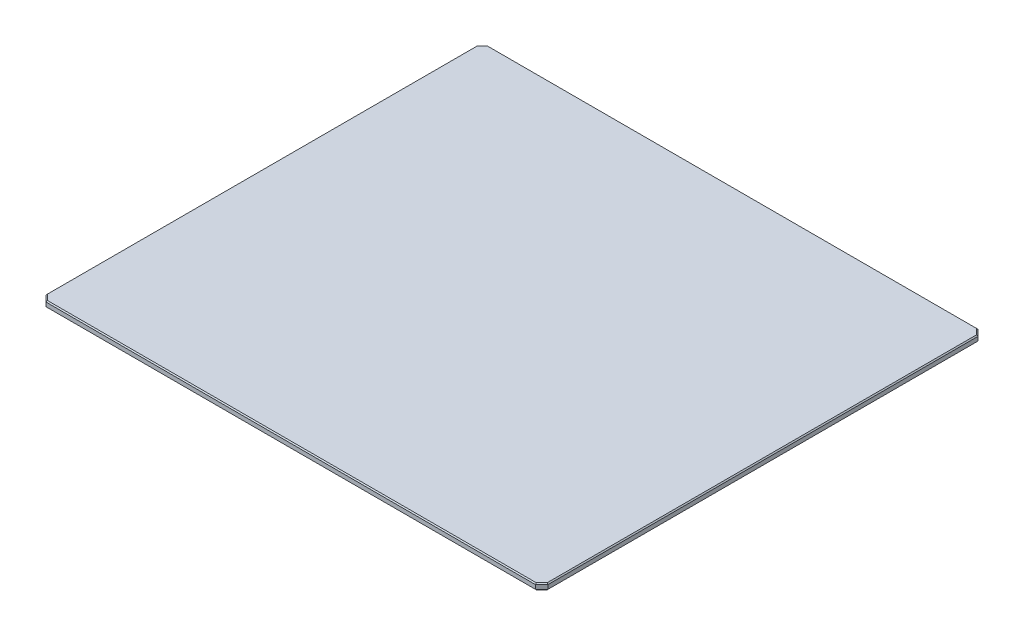
ISO-10303-21;
HEADER;
FILE_DESCRIPTION(('STEP AP214'),'2;1');
FILE_NAME('part.step','',(''),(''),'','','');
FILE_SCHEMA(('AUTOMOTIVE_DESIGN { 1 0 10303 214 1 1 1 1 }'));
ENDSEC;
DATA;
#1=APPLICATION_CONTEXT('core data for automotive mechanical design processes');
#2=APPLICATION_PROTOCOL_DEFINITION('international standard','automotive_design',2000,#1);
#3=PRODUCT_CONTEXT('',#1,'mechanical');
#4=PRODUCT('Part','Part','',(#3));
#5=PRODUCT_RELATED_PRODUCT_CATEGORY('part','',(#4));
#6=PRODUCT_DEFINITION_FORMATION('','',#4);
#7=PRODUCT_DEFINITION_CONTEXT('part definition',#1,'design');
#8=PRODUCT_DEFINITION('design','',#6,#7);
#9=PRODUCT_DEFINITION_SHAPE('','',#8);
#10=(LENGTH_UNIT() NAMED_UNIT(*) SI_UNIT(.MILLI.,.METRE.));
#11=(NAMED_UNIT(*) PLANE_ANGLE_UNIT() SI_UNIT($,.RADIAN.));
#12=(NAMED_UNIT(*) SI_UNIT($,.STERADIAN.) SOLID_ANGLE_UNIT());
#13=UNCERTAINTY_MEASURE_WITH_UNIT(LENGTH_MEASURE(1.E-05),#10,'distance_accuracy_value','');
#14=(GEOMETRIC_REPRESENTATION_CONTEXT(3) GLOBAL_UNCERTAINTY_ASSIGNED_CONTEXT((#13)) GLOBAL_UNIT_ASSIGNED_CONTEXT((#10,
#11,#12)) REPRESENTATION_CONTEXT('',''));
#15=CARTESIAN_POINT('',(0.,0.,0.));
#16=DIRECTION('',(0.,0.,1.));
#17=DIRECTION('',(1.,0.,0.));
#18=AXIS2_PLACEMENT_3D('',#15,#16,#17);
#19=CARTESIAN_POINT('',(93.4712158467732,81.9788063389953,66.7897253042204));
#20=DIRECTION('',(0.,0.,1.));
#21=DIRECTION('',(1.,0.,0.));
#22=AXIS2_PLACEMENT_3D('',#19,#20,#21);
#23=PLANE('',#22);
#24=DIRECTION('',(0.,-1.,0.));
#25=VECTOR('',#24,1.);
#26=CARTESIAN_POINT('',(90.4712158467733,81.9788063389953,66.7897253042204));
#27=LINE('',#26,#25);
#28=CARTESIAN_POINT('',(90.4712158467733,81.4788063389953,66.7897253042204));
#29=VERTEX_POINT('',#28);
#30=CARTESIAN_POINT('',(90.4712158467733,79.4788063389952,66.7897253042204));
#31=VERTEX_POINT('',#30);
#32=EDGE_CURVE('E280',#29,#31,#27,.T.);
#33=ORIENTED_EDGE('',*,*,#32,.T.);
#34=DIRECTION('',(-1.,0.,0.));
#35=VECTOR('',#34,1.);
#36=CARTESIAN_POINT('',(93.4712158467732,79.4788063389952,66.7897253042204));
#37=LINE('',#36,#35);
#38=CARTESIAN_POINT('',(-148.528784153227,79.4788063389953,66.7897253042204));
#39=VERTEX_POINT('',#38);
#40=EDGE_CURVE('E57',#31,#39,#37,.T.);
#41=ORIENTED_EDGE('',*,*,#40,.T.);
#42=DIRECTION('',(0.,1.,0.));
#43=VECTOR('',#42,1.);
#44=CARTESIAN_POINT('',(-148.528784153227,81.9788063389953,66.7897253042204));
#45=LINE('',#44,#43);
#46=CARTESIAN_POINT('',(-148.528784153227,81.4788063389953,66.7897253042204));
#47=VERTEX_POINT('',#46);
#48=EDGE_CURVE('E281',#39,#47,#45,.T.);
#49=ORIENTED_EDGE('',*,*,#48,.T.);
#50=DIRECTION('',(1.,0.,0.));
#51=VECTOR('',#50,1.);
#52=CARTESIAN_POINT('',(90.4712158467733,81.4788063389953,66.7897253042204));
#53=LINE('',#52,#51);
#54=EDGE_CURVE('E196',#47,#29,#53,.T.);
#55=ORIENTED_EDGE('',*,*,#54,.T.);
#56=EDGE_LOOP('',(#33,#41,#49,#55));
#57=FACE_BOUND('',#56,.T.);
#58=ADVANCED_FACE('F33',(#57),#23,.F.);
#59=CARTESIAN_POINT('',(-151.528784153227,81.9788063389953,66.7897253042204));
#60=DIRECTION('',(1.,0.,0.));
#61=DIRECTION('',(0.,0.,-1.));
#62=AXIS2_PLACEMENT_3D('',#59,#60,#61);
#63=PLANE('',#62);
#64=DIRECTION('',(0.,-1.,0.));
#65=VECTOR('',#64,1.);
#66=CARTESIAN_POINT('',(-151.528784153227,81.9788063389953,69.7897253042204));
#67=LINE('',#66,#65);
#68=CARTESIAN_POINT('',(-151.528784153227,81.4788063389953,69.7897253042204));
#69=VERTEX_POINT('',#68);
#70=CARTESIAN_POINT('',(-151.528784153227,79.4788063389952,69.7897253042204));
#71=VERTEX_POINT('',#70);
#72=EDGE_CURVE('E282',#69,#71,#67,.T.);
#73=ORIENTED_EDGE('',*,*,#72,.T.);
#74=DIRECTION('',(0.,0.,1.));
#75=VECTOR('',#74,1.);
#76=CARTESIAN_POINT('',(-151.528784153227,79.4788063389952,66.7897253042204));
#77=LINE('',#76,#75);
#78=CARTESIAN_POINT('',(-151.528784153227,79.4788063389952,279.774422834796));
#79=VERTEX_POINT('',#78);
#80=EDGE_CURVE('E11',#71,#79,#77,.T.);
#81=ORIENTED_EDGE('',*,*,#80,.T.);
#82=DIRECTION('',(0.,1.,0.));
#83=VECTOR('',#82,1.);
#84=CARTESIAN_POINT('',(-151.528784153227,81.9788063389953,279.774422834796));
#85=LINE('',#84,#83);
#86=CARTESIAN_POINT('',(-151.528784153227,81.4788063389953,279.774422834796));
#87=VERTEX_POINT('',#86);
#88=EDGE_CURVE('E216',#79,#87,#85,.T.);
#89=ORIENTED_EDGE('',*,*,#88,.T.);
#90=DIRECTION('',(0.,0.,-1.));
#91=VECTOR('',#90,1.);
#92=CARTESIAN_POINT('',(-151.528784153227,81.4788063389953,69.7897253042204));
#93=LINE('',#92,#91);
#94=EDGE_CURVE('E191',#87,#69,#93,.T.);
#95=ORIENTED_EDGE('',*,*,#94,.T.);
#96=EDGE_LOOP('',(#73,#81,#89,#95));
#97=FACE_BOUND('',#96,.T.);
#98=ADVANCED_FACE('F346',(#97),#63,.F.);
#99=CARTESIAN_POINT('',(-151.528784153227,81.9788063389953,282.774422834796));
#100=DIRECTION('',(0.,0.,-1.));
#101=DIRECTION('',(-1.,0.,0.));
#102=AXIS2_PLACEMENT_3D('',#99,#100,#101);
#103=PLANE('',#102);
#104=DIRECTION('',(0.,-1.,0.));
#105=VECTOR('',#104,1.);
#106=CARTESIAN_POINT('',(-148.528784153227,81.9788063389953,282.774422834796));
#107=LINE('',#106,#105);
#108=CARTESIAN_POINT('',(-148.528784153227,81.4788063389953,282.774422834796));
#109=VERTEX_POINT('',#108);
#110=CARTESIAN_POINT('',(-148.528784153227,79.4788063389952,282.774422834796));
#111=VERTEX_POINT('',#110);
#112=EDGE_CURVE('E290',#109,#111,#107,.T.);
#113=ORIENTED_EDGE('',*,*,#112,.T.);
#114=DIRECTION('',(1.,0.,0.));
#115=VECTOR('',#114,1.);
#116=CARTESIAN_POINT('',(-151.528784153227,79.4788063389952,282.774422834796));
#117=LINE('',#116,#115);
#118=CARTESIAN_POINT('',(90.4712158467733,79.4788063389952,282.774422834796));
#119=VERTEX_POINT('',#118);
#120=EDGE_CURVE('E236',#111,#119,#117,.T.);
#121=ORIENTED_EDGE('',*,*,#120,.T.);
#122=DIRECTION('',(0.,1.,0.));
#123=VECTOR('',#122,1.);
#124=CARTESIAN_POINT('',(90.4712158467733,81.9788063389953,282.774422834796));
#125=LINE('',#124,#123);
#126=CARTESIAN_POINT('',(90.4712158467733,81.4788063389953,282.774422834796));
#127=VERTEX_POINT('',#126);
#128=EDGE_CURVE('E284',#119,#127,#125,.T.);
#129=ORIENTED_EDGE('',*,*,#128,.T.);
#130=DIRECTION('',(-1.,0.,0.));
#131=VECTOR('',#130,1.);
#132=CARTESIAN_POINT('',(-148.528784153227,81.4788063389953,282.774422834796));
#133=LINE('',#132,#131);
#134=EDGE_CURVE('E186',#127,#109,#133,.T.);
#135=ORIENTED_EDGE('',*,*,#134,.T.);
#136=EDGE_LOOP('',(#113,#121,#129,#135));
#137=FACE_BOUND('',#136,.T.);
#138=ADVANCED_FACE('F367',(#137),#103,.F.);
#139=CARTESIAN_POINT('',(93.4712158467732,81.9788063389953,282.774422834796));
#140=DIRECTION('',(-1.,0.,0.));
#141=DIRECTION('',(0.,0.,1.));
#142=AXIS2_PLACEMENT_3D('',#139,#140,#141);
#143=PLANE('',#142);
#144=DIRECTION('',(0.,-1.,0.));
#145=VECTOR('',#144,1.);
#146=CARTESIAN_POINT('',(93.4712158467732,81.9788063389953,279.774422834796));
#147=LINE('',#146,#145);
#148=CARTESIAN_POINT('',(93.4712158467732,81.4788063389953,279.774422834796));
#149=VERTEX_POINT('',#148);
#150=CARTESIAN_POINT('',(93.4712158467732,79.4788063389952,279.774422834796));
#151=VERTEX_POINT('',#150);
#152=EDGE_CURVE('E293',#149,#151,#147,.T.);
#153=ORIENTED_EDGE('',*,*,#152,.T.);
#154=DIRECTION('',(0.,0.,-1.));
#155=VECTOR('',#154,1.);
#156=CARTESIAN_POINT('',(93.4712158467732,79.4788063389952,282.774422834796));
#157=LINE('',#156,#155);
#158=CARTESIAN_POINT('',(93.4712158467732,79.4788063389952,69.7897253042203));
#159=VERTEX_POINT('',#158);
#160=EDGE_CURVE('E240',#151,#159,#157,.T.);
#161=ORIENTED_EDGE('',*,*,#160,.T.);
#162=DIRECTION('',(0.,1.,0.));
#163=VECTOR('',#162,1.);
#164=CARTESIAN_POINT('',(93.4712158467732,81.9788063389953,69.7897253042203));
#165=LINE('',#164,#163);
#166=CARTESIAN_POINT('',(93.4712158467732,81.4788063389953,69.7897253042203));
#167=VERTEX_POINT('',#166);
#168=EDGE_CURVE('E169',#159,#167,#165,.T.);
#169=ORIENTED_EDGE('',*,*,#168,.T.);
#170=DIRECTION('',(0.,0.,1.));
#171=VECTOR('',#170,1.);
#172=CARTESIAN_POINT('',(93.4712158467732,81.4788063389953,279.774422834796));
#173=LINE('',#172,#171);
#174=EDGE_CURVE('E176',#167,#149,#173,.T.);
#175=ORIENTED_EDGE('',*,*,#174,.T.);
#176=EDGE_LOOP('',(#153,#161,#169,#175));
#177=FACE_BOUND('',#176,.T.);
#178=ADVANCED_FACE('F315',(#177),#143,.F.);
#179=CARTESIAN_POINT('',(0.,81.9788063389953,0.));
#180=DIRECTION('',(0.,1.,0.));
#181=DIRECTION('',(0.,0.,1.));
#182=AXIS2_PLACEMENT_3D('',#179,#180,#181);
#183=PLANE('',#182);
#184=DIRECTION('',(0.,0.,-1.));
#185=VECTOR('',#184,1.);
#186=CARTESIAN_POINT('',(92.9712158467732,81.9788063389953,69.7897253042204));
#187=LINE('',#186,#185);
#188=CARTESIAN_POINT('',(92.9712158467732,81.9788063389953,279.567316053609));
#189=VERTEX_POINT('',#188);
#190=CARTESIAN_POINT('',(92.9712158467732,81.9788063389953,69.9968320854069));
#191=VERTEX_POINT('',#190);
#192=EDGE_CURVE('E173',#189,#191,#187,.T.);
#193=ORIENTED_EDGE('',*,*,#192,.T.);
#194=DIRECTION('',(-0.707106781186546,0.,-0.707106781186549));
#195=VECTOR('',#194,1.);
#196=CARTESIAN_POINT('',(11.4871918806834,81.9788063389953,-11.4871918806833));
#197=LINE('',#196,#195);
#198=CARTESIAN_POINT('',(90.2641090655867,81.9788063389953,67.2897253042204));
#199=VERTEX_POINT('',#198);
#200=EDGE_CURVE('E154',#191,#199,#197,.T.);
#201=ORIENTED_EDGE('',*,*,#200,.T.);
#202=DIRECTION('',(-1.,0.,0.));
#203=VECTOR('',#202,1.);
#204=CARTESIAN_POINT('',(-148.528784153227,81.9788063389953,67.2897253042204));
#205=LINE('',#204,#203);
#206=CARTESIAN_POINT('',(-148.32167737204,81.9788063389953,67.2897253042204));
#207=VERTEX_POINT('',#206);
#208=EDGE_CURVE('E162',#199,#207,#205,.T.);
#209=ORIENTED_EDGE('',*,*,#208,.T.);
#210=DIRECTION('',(-0.707106781186551,0.,0.707106781186544));
#211=VECTOR('',#210,1.);
#212=CARTESIAN_POINT('',(-40.5159760339092,81.9788063389953,-40.5159760339096));
#213=LINE('',#212,#211);
#214=CARTESIAN_POINT('',(-151.028784153227,81.9788063389953,69.9968320854069));
#215=VERTEX_POINT('',#214);
#216=EDGE_CURVE('E168',#207,#215,#213,.T.);
#217=ORIENTED_EDGE('',*,*,#216,.T.);
#218=DIRECTION('',(0.,0.,1.));
#219=VECTOR('',#218,1.);
#220=CARTESIAN_POINT('',(-151.028784153227,81.9788063389953,279.774422834796));
#221=LINE('',#220,#219);
#222=CARTESIAN_POINT('',(-151.028784153227,81.9788063389953,279.567316053609));
#223=VERTEX_POINT('',#222);
#224=EDGE_CURVE('E298',#215,#223,#221,.T.);
#225=ORIENTED_EDGE('',*,*,#224,.T.);
#226=DIRECTION('',(0.707106781186548,0.,0.707106781186548));
#227=VECTOR('',#226,1.);
#228=CARTESIAN_POINT('',(-215.298050103418,81.9788063389953,215.298050103418));
#229=LINE('',#228,#227);
#230=CARTESIAN_POINT('',(-148.32167737204,81.9788063389953,282.274422834796));
#231=VERTEX_POINT('',#230);
#232=EDGE_CURVE('E300',#223,#231,#229,.T.);
#233=ORIENTED_EDGE('',*,*,#232,.T.);
#234=DIRECTION('',(1.,0.,0.));
#235=VECTOR('',#234,1.);
#236=CARTESIAN_POINT('',(90.4712158467731,81.9788063389953,282.274422834796));
#237=LINE('',#236,#235);
#238=CARTESIAN_POINT('',(90.2641090655867,81.9788063389953,282.274422834796));
#239=VERTEX_POINT('',#238);
#240=EDGE_CURVE('E302',#231,#239,#237,.T.);
#241=ORIENTED_EDGE('',*,*,#240,.T.);
#242=DIRECTION('',(0.707106781186546,0.,-0.707106781186549));
#243=VECTOR('',#242,1.);
#244=CARTESIAN_POINT('',(186.269265950192,81.9788063389953,186.269265950191));
#245=LINE('',#244,#243);
#246=EDGE_CURVE('E178',#239,#189,#245,.T.);
#247=ORIENTED_EDGE('',*,*,#246,.T.);
#248=EDGE_LOOP('',(#193,#201,#209,#217,#225,#233,#241,#247));
#249=FACE_BOUND('',#248,.T.);
#250=ADVANCED_FACE('F171',(#249),#183,.T.);
#251=CARTESIAN_POINT('',(0.,78.9788063389953,0.));
#252=DIRECTION('',(0.,1.,0.));
#253=DIRECTION('',(0.,0.,1.));
#254=AXIS2_PLACEMENT_3D('',#251,#252,#253);
#255=PLANE('',#254);
#256=DIRECTION('',(-1.,0.,0.));
#257=VECTOR('',#256,1.);
#258=CARTESIAN_POINT('',(0.,78.9788063389953,282.274422834796));
#259=LINE('',#258,#257);
#260=CARTESIAN_POINT('',(90.2641090655868,78.9788063389953,282.274422834796));
#261=VERTEX_POINT('',#260);
#262=CARTESIAN_POINT('',(-148.32167737204,78.9788063389953,282.274422834796));
#263=VERTEX_POINT('',#262);
#264=EDGE_CURVE('E228',#261,#263,#259,.T.);
#265=ORIENTED_EDGE('',*,*,#264,.T.);
#266=DIRECTION('',(-0.707106781186548,0.,-0.707106781186548));
#267=VECTOR('',#266,1.);
#268=CARTESIAN_POINT('',(-151.175230762633,78.9788063389953,279.420869444203));
#269=LINE('',#268,#267);
#270=CARTESIAN_POINT('',(-151.028784153227,78.9788063389953,279.567316053609));
#271=VERTEX_POINT('',#270);
#272=EDGE_CURVE('E230',#263,#271,#269,.T.);
#273=ORIENTED_EDGE('',*,*,#272,.T.);
#274=DIRECTION('',(0.,0.,-1.));
#275=VECTOR('',#274,1.);
#276=CARTESIAN_POINT('',(-151.028784153227,78.9788063389953,0.));
#277=LINE('',#276,#275);
#278=CARTESIAN_POINT('',(-151.028784153227,78.9788063389953,69.9968320854069));
#279=VERTEX_POINT('',#278);
#280=EDGE_CURVE('E197',#271,#279,#277,.T.);
#281=ORIENTED_EDGE('',*,*,#280,.T.);
#282=DIRECTION('',(0.707106781186551,0.,-0.707106781186544));
#283=VECTOR('',#282,1.);
#284=CARTESIAN_POINT('',(-148.175230762633,78.9788063389953,67.1432786948136));
#285=LINE('',#284,#283);
#286=CARTESIAN_POINT('',(-148.32167737204,78.9788063389953,67.2897253042204));
#287=VERTEX_POINT('',#286);
#288=EDGE_CURVE('E218',#279,#287,#285,.T.);
#289=ORIENTED_EDGE('',*,*,#288,.T.);
#290=DIRECTION('',(1.,0.,0.));
#291=VECTOR('',#290,1.);
#292=CARTESIAN_POINT('',(0.,78.9788063389953,67.2897253042203));
#293=LINE('',#292,#291);
#294=CARTESIAN_POINT('',(90.2641090655867,78.9788063389953,67.2897253042203));
#295=VERTEX_POINT('',#294);
#296=EDGE_CURVE('E220',#287,#295,#293,.T.);
#297=ORIENTED_EDGE('',*,*,#296,.T.);
#298=DIRECTION('',(0.707106781186546,0.,0.707106781186549));
#299=VECTOR('',#298,1.);
#300=CARTESIAN_POINT('',(93.11766245618,78.9788063389953,70.1432786948136));
#301=LINE('',#300,#299);
#302=CARTESIAN_POINT('',(92.9712158467733,78.9788063389953,69.9968320854069));
#303=VERTEX_POINT('',#302);
#304=EDGE_CURVE('E222',#295,#303,#301,.T.);
#305=ORIENTED_EDGE('',*,*,#304,.T.);
#306=DIRECTION('',(0.,0.,1.));
#307=VECTOR('',#306,1.);
#308=CARTESIAN_POINT('',(92.9712158467733,78.9788063389953,0.));
#309=LINE('',#308,#307);
#310=CARTESIAN_POINT('',(92.9712158467733,78.9788063389953,279.567316053609));
#311=VERTEX_POINT('',#310);
#312=EDGE_CURVE('E224',#303,#311,#309,.T.);
#313=ORIENTED_EDGE('',*,*,#312,.T.);
#314=DIRECTION('',(-0.707106781186546,0.,0.707106781186549));
#315=VECTOR('',#314,1.);
#316=CARTESIAN_POINT('',(90.11766245618,78.9788063389953,282.420869444203));
#317=LINE('',#316,#315);
#318=EDGE_CURVE('E226',#311,#261,#317,.T.);
#319=ORIENTED_EDGE('',*,*,#318,.T.);
#320=EDGE_LOOP('',(#265,#273,#281,#289,#297,#305,#313,#319));
#321=FACE_BOUND('',#320,.T.);
#322=ADVANCED_FACE('F332',(#321),#255,.F.);
#323=CARTESIAN_POINT('',(-151.528784153227,81.9788063389953,69.7897253042204));
#324=DIRECTION('',(0.707106781186544,0.,0.707106781186551));
#325=DIRECTION('',(0.,-1.,0.));
#326=AXIS2_PLACEMENT_3D('',#323,#324,#325);
#327=PLANE('',#326);
#328=ORIENTED_EDGE('',*,*,#48,.F.);
#329=DIRECTION('',(0.707106781186551,0.,-0.707106781186544));
#330=VECTOR('',#329,1.);
#331=CARTESIAN_POINT('',(-151.528784153227,79.4788063389953,69.7897253042204));
#332=LINE('',#331,#330);
#333=EDGE_CURVE('E42',#39,#71,#332,.F.);
#334=ORIENTED_EDGE('',*,*,#333,.T.);
#335=ORIENTED_EDGE('',*,*,#72,.F.);
#336=DIRECTION('',(-0.707106781186551,0.,0.707106781186544));
#337=VECTOR('',#336,1.);
#338=CARTESIAN_POINT('',(-151.528784153227,81.4788063389953,69.7897253042204));
#339=LINE('',#338,#337);
#340=EDGE_CURVE('E193',#69,#47,#339,.F.);
#341=ORIENTED_EDGE('',*,*,#340,.T.);
#342=EDGE_LOOP('',(#328,#334,#335,#341));
#343=FACE_BOUND('',#342,.T.);
#344=ADVANCED_FACE('F371',(#343),#327,.F.);
#345=CARTESIAN_POINT('',(-148.528784153227,81.9788063389953,282.774422834796));
#346=DIRECTION('',(0.707106781186547,0.,-0.707106781186547));
#347=DIRECTION('',(0.,-1.,0.));
#348=AXIS2_PLACEMENT_3D('',#345,#346,#347);
#349=PLANE('',#348);
#350=ORIENTED_EDGE('',*,*,#88,.F.);
#351=DIRECTION('',(-0.707106781186548,0.,-0.707106781186548));
#352=VECTOR('',#351,1.);
#353=CARTESIAN_POINT('',(-148.528784153227,79.4788063389953,282.774422834796));
#354=LINE('',#353,#352);
#355=EDGE_CURVE('E233',#79,#111,#354,.F.);
#356=ORIENTED_EDGE('',*,*,#355,.T.);
#357=ORIENTED_EDGE('',*,*,#112,.F.);
#358=DIRECTION('',(0.707106781186548,0.,0.707106781186548));
#359=VECTOR('',#358,1.);
#360=CARTESIAN_POINT('',(-148.528784153227,81.4788063389953,282.774422834796));
#361=LINE('',#360,#359);
#362=EDGE_CURVE('E188',#109,#87,#361,.F.);
#363=ORIENTED_EDGE('',*,*,#362,.T.);
#364=EDGE_LOOP('',(#350,#356,#357,#363));
#365=FACE_BOUND('',#364,.T.);
#366=ADVANCED_FACE('F349',(#365),#349,.F.);
#367=CARTESIAN_POINT('',(90.4712158467733,81.9788063389953,66.7897253042204));
#368=DIRECTION('',(-0.707106781186549,0.,0.707106781186546));
#369=DIRECTION('',(0.,-1.,0.));
#370=AXIS2_PLACEMENT_3D('',#367,#368,#369);
#371=PLANE('',#370);
#372=ORIENTED_EDGE('',*,*,#168,.F.);
#373=DIRECTION('',(0.707106781186546,0.,0.707106781186549));
#374=VECTOR('',#373,1.);
#375=CARTESIAN_POINT('',(90.4712158467733,79.4788063389952,66.7897253042204));
#376=LINE('',#375,#374);
#377=EDGE_CURVE('E242',#159,#31,#376,.F.);
#378=ORIENTED_EDGE('',*,*,#377,.T.);
#379=ORIENTED_EDGE('',*,*,#32,.F.);
#380=DIRECTION('',(-0.707106781186546,0.,-0.707106781186549));
#381=VECTOR('',#380,1.);
#382=CARTESIAN_POINT('',(90.4712158467733,81.4788063389953,66.7897253042204));
#383=LINE('',#382,#381);
#384=EDGE_CURVE('E156',#29,#167,#383,.F.);
#385=ORIENTED_EDGE('',*,*,#384,.T.);
#386=EDGE_LOOP('',(#372,#378,#379,#385));
#387=FACE_BOUND('',#386,.T.);
#388=ADVANCED_FACE('F279',(#387),#371,.F.);
#389=CARTESIAN_POINT('',(93.4712158467732,81.9788063389953,279.774422834796));
#390=DIRECTION('',(-0.707106781186549,0.,-0.707106781186546));
#391=DIRECTION('',(0.,-1.,0.));
#392=AXIS2_PLACEMENT_3D('',#389,#390,#391);
#393=PLANE('',#392);
#394=ORIENTED_EDGE('',*,*,#128,.F.);
#395=DIRECTION('',(-0.707106781186546,0.,0.707106781186549));
#396=VECTOR('',#395,1.);
#397=CARTESIAN_POINT('',(93.4712158467732,79.4788063389952,279.774422834796));
#398=LINE('',#397,#396);
#399=EDGE_CURVE('E238',#119,#151,#398,.F.);
#400=ORIENTED_EDGE('',*,*,#399,.T.);
#401=ORIENTED_EDGE('',*,*,#152,.F.);
#402=DIRECTION('',(0.707106781186546,0.,-0.707106781186549));
#403=VECTOR('',#402,1.);
#404=CARTESIAN_POINT('',(93.4712158467732,81.4788063389953,279.774422834796));
#405=LINE('',#404,#403);
#406=EDGE_CURVE('E183',#149,#127,#405,.F.);
#407=ORIENTED_EDGE('',*,*,#406,.T.);
#408=EDGE_LOOP('',(#394,#400,#401,#407));
#409=FACE_BOUND('',#408,.T.);
#410=ADVANCED_FACE('F318',(#409),#393,.F.);
#411=CARTESIAN_POINT('',(-215.298050103418,81.9788063389953,215.298050103418));
#412=DIRECTION('',(-0.499999999999979,0.707106781186577,0.499999999999979));
#413=DIRECTION('',(-0.707106781186548,0.,-0.707106781186548));
#414=AXIS2_PLACEMENT_3D('',#411,#412,#413);
#415=PLANE('',#414);
#416=DIRECTION('',(0.678598344545859,0.678598344545822,-0.281084637714852));
#417=VECTOR('',#416,1.);
#418=CARTESIAN_POINT('',(-97.7031162812097,135.304474211009,257.479101198414));
#419=LINE('',#418,#417);
#420=EDGE_CURVE('E210',#87,#223,#419,.T.);
#421=ORIENTED_EDGE('',*,*,#420,.F.);
#422=ORIENTED_EDGE('',*,*,#362,.F.);
#423=DIRECTION('',(0.281084637714852,0.678598344545822,-0.678598344545859));
#424=VECTOR('',#423,1.);
#425=CARTESIAN_POINT('',(-140.838072614636,100.045826439758,264.207402734032));
#426=LINE('',#425,#424);
#427=EDGE_CURVE('E213',#231,#109,#426,.F.);
#428=ORIENTED_EDGE('',*,*,#427,.F.);
#429=ORIENTED_EDGE('',*,*,#232,.F.);
#430=EDGE_LOOP('',(#421,#422,#428,#429));
#431=FACE_BOUND('',#430,.T.);
#432=ADVANCED_FACE('F380',(#431),#415,.T.);
#433=CARTESIAN_POINT('',(0.,81.9788063389953,282.274422834796));
#434=DIRECTION('',(0.,0.707106781186567,0.707106781186528));
#435=DIRECTION('',(-1.,0.,0.));
#436=AXIS2_PLACEMENT_3D('',#433,#434,#435);
#437=PLANE('',#436);
#438=ORIENTED_EDGE('',*,*,#427,.T.);
#439=ORIENTED_EDGE('',*,*,#134,.F.);
#440=DIRECTION('',(-0.281084637714828,0.678598344545827,-0.678598344545864));
#441=VECTOR('',#440,1.);
#442=CARTESIAN_POINT('',(83.1324705647158,99.196104729739,265.057124444051));
#443=LINE('',#442,#441);
#444=EDGE_CURVE('E207',#239,#127,#443,.F.);
#445=ORIENTED_EDGE('',*,*,#444,.F.);
#446=ORIENTED_EDGE('',*,*,#240,.F.);
#447=EDGE_LOOP('',(#438,#439,#445,#446));
#448=FACE_BOUND('',#447,.T.);
#449=ADVANCED_FACE('F396',(#448),#437,.T.);
#450=CARTESIAN_POINT('',(-151.028784153227,81.9788063389953,0.));
#451=DIRECTION('',(-0.707106781186528,0.707106781186567,0.));
#452=DIRECTION('',(0.,0.,-1.));
#453=AXIS2_PLACEMENT_3D('',#450,#451,#452);
#454=PLANE('',#453);
#455=ORIENTED_EDGE('',*,*,#420,.T.);
#456=ORIENTED_EDGE('',*,*,#224,.F.);
#457=DIRECTION('',(0.678598344545864,0.678598344545826,0.281084637714829));
#458=VECTOR('',#457,1.);
#459=CARTESIAN_POINT('',(-121.217717291012,111.789873201209,82.3449802885477));
#460=LINE('',#459,#458);
#461=EDGE_CURVE('E204',#69,#215,#460,.T.);
#462=ORIENTED_EDGE('',*,*,#461,.F.);
#463=ORIENTED_EDGE('',*,*,#94,.F.);
#464=EDGE_LOOP('',(#455,#456,#462,#463));
#465=FACE_BOUND('',#464,.T.);
#466=ADVANCED_FACE('F393',(#465),#454,.T.);
#467=CARTESIAN_POINT('',(186.269265950192,81.9788063389953,186.269265950191));
#468=DIRECTION('',(0.499999999999987,0.707106781186567,0.499999999999985));
#469=DIRECTION('',(-0.707106781186546,0.,0.707106781186549));
#470=AXIS2_PLACEMENT_3D('',#467,#468,#469);
#471=PLANE('',#470);
#472=ORIENTED_EDGE('',*,*,#444,.T.);
#473=ORIENTED_EDGE('',*,*,#406,.F.);
#474=DIRECTION('',(-0.678598344545864,0.678598344545827,-0.281084637714827));
#475=VECTOR('',#474,1.);
#476=CARTESIAN_POINT('',(118.138564836262,56.8114573495077,289.991973334032));
#477=LINE('',#476,#475);
#478=EDGE_CURVE('E201',#189,#149,#477,.F.);
#479=ORIENTED_EDGE('',*,*,#478,.F.);
#480=ORIENTED_EDGE('',*,*,#246,.F.);
#481=EDGE_LOOP('',(#472,#473,#479,#480));
#482=FACE_BOUND('',#481,.T.);
#483=ADVANCED_FACE('F309',(#482),#471,.T.);
#484=CARTESIAN_POINT('',(-40.5159760339092,81.9788063389953,-40.5159760339096));
#485=DIRECTION('',(-0.499999999999984,0.707106781186567,-0.499999999999988));
#486=DIRECTION('',(0.707106781186551,0.,-0.707106781186544));
#487=AXIS2_PLACEMENT_3D('',#484,#485,#486);
#488=PLANE('',#487);
#489=ORIENTED_EDGE('',*,*,#461,.T.);
#490=ORIENTED_EDGE('',*,*,#216,.F.);
#491=DIRECTION('',(0.281084637714821,0.678598344545826,0.678598344545868));
#492=VECTOR('',#491,1.);
#493=CARTESIAN_POINT('',(-136.602993214957,110.270212564192,95.5811315294188));
#494=LINE('',#493,#492);
#495=EDGE_CURVE('E165',#47,#207,#494,.T.);
#496=ORIENTED_EDGE('',*,*,#495,.F.);
#497=ORIENTED_EDGE('',*,*,#340,.F.);
#498=EDGE_LOOP('',(#489,#490,#496,#497));
#499=FACE_BOUND('',#498,.T.);
#500=ADVANCED_FACE('F387',(#499),#488,.T.);
#501=CARTESIAN_POINT('',(92.9712158467732,81.9788063389953,0.));
#502=DIRECTION('',(0.707106781186528,0.707106781186567,0.));
#503=DIRECTION('',(0.,0.,1.));
#504=AXIS2_PLACEMENT_3D('',#501,#502,#503);
#505=PLANE('',#504);
#506=ORIENTED_EDGE('',*,*,#478,.T.);
#507=ORIENTED_EDGE('',*,*,#174,.F.);
#508=DIRECTION('',(-0.678598344545867,0.678598344545829,0.281084637714814));
#509=VECTOR('',#508,1.);
#510=CARTESIAN_POINT('',(106.322661475573,68.6273607101961,64.4664822286712));
#511=LINE('',#510,#509);
#512=EDGE_CURVE('E159',#191,#167,#511,.F.);
#513=ORIENTED_EDGE('',*,*,#512,.F.);
#514=ORIENTED_EDGE('',*,*,#192,.F.);
#515=EDGE_LOOP('',(#506,#507,#513,#514));
#516=FACE_BOUND('',#515,.T.);
#517=ADVANCED_FACE('F312',(#516),#505,.T.);
#518=CARTESIAN_POINT('',(0.,81.9788063389953,67.2897253042204));
#519=DIRECTION('',(0.,0.707106781186569,-0.707106781186526));
#520=DIRECTION('',(1.,0.,0.));
#521=AXIS2_PLACEMENT_3D('',#518,#519,#520);
#522=PLANE('',#521);
#523=ORIENTED_EDGE('',*,*,#495,.T.);
#524=ORIENTED_EDGE('',*,*,#208,.F.);
#525=DIRECTION('',(0.281084637714811,-0.678598344545828,-0.67859834454587));
#526=VECTOR('',#525,1.);
#527=CARTESIAN_POINT('',(83.1324705647167,99.196104729738,84.5070236949642));
#528=LINE('',#527,#526);
#529=EDGE_CURVE('E149',#29,#199,#528,.F.);
#530=ORIENTED_EDGE('',*,*,#529,.F.);
#531=ORIENTED_EDGE('',*,*,#54,.F.);
#532=EDGE_LOOP('',(#523,#524,#530,#531));
#533=FACE_BOUND('',#532,.T.);
#534=ADVANCED_FACE('F163',(#533),#522,.T.);
#535=CARTESIAN_POINT('',(11.4871918806834,81.9788063389953,-11.4871918806833));
#536=DIRECTION('',(0.499999999999991,0.707106781186562,-0.499999999999988));
#537=DIRECTION('',(0.707106781186546,0.,0.707106781186549));
#538=AXIS2_PLACEMENT_3D('',#535,#536,#537);
#539=PLANE('',#538);
#540=ORIENTED_EDGE('',*,*,#512,.T.);
#541=ORIENTED_EDGE('',*,*,#384,.F.);
#542=ORIENTED_EDGE('',*,*,#529,.T.);
#543=ORIENTED_EDGE('',*,*,#200,.F.);
#544=EDGE_LOOP('',(#540,#541,#542,#543));
#545=FACE_BOUND('',#544,.T.);
#546=ADVANCED_FACE('F152',(#545),#539,.T.);
#547=CARTESIAN_POINT('',(11.4871918806834,78.9788063389953,-11.4871918806834));
#548=DIRECTION('',(-0.499999999999998,0.707106781186552,0.499999999999995));
#549=DIRECTION('',(0.707106781186546,0.,0.707106781186549));
#550=AXIS2_PLACEMENT_3D('',#547,#548,#549);
#551=PLANE('',#550);
#552=DIRECTION('',(-0.281084637714828,-0.678598344545843,0.678598344545848));
#553=VECTOR('',#552,1.);
#554=CARTESIAN_POINT('',(90.7082415674511,80.0510370484869,66.2174945947287));
#555=LINE('',#554,#553);
#556=EDGE_CURVE('E261',#31,#295,#555,.T.);
#557=ORIENTED_EDGE('',*,*,#556,.F.);
#558=ORIENTED_EDGE('',*,*,#377,.F.);
#559=DIRECTION('',(-0.678598344545845,-0.678598344545845,0.281084637714832));
#560=VECTOR('',#559,1.);
#561=CARTESIAN_POINT('',(70.9907257298942,56.9983162221161,79.1014491994264));
#562=LINE('',#561,#560);
#563=EDGE_CURVE('E37',#303,#159,#562,.F.);
#564=ORIENTED_EDGE('',*,*,#563,.F.);
#565=ORIENTED_EDGE('',*,*,#304,.F.);
#566=EDGE_LOOP('',(#557,#558,#564,#565));
#567=FACE_BOUND('',#566,.T.);
#568=ADVANCED_FACE('F35',(#567),#551,.F.);
#569=CARTESIAN_POINT('',(93.4712158467732,79.4788063389952,282.774422834796));
#570=DIRECTION('',(-0.707106781186547,0.707106781186547,0.));
#571=DIRECTION('',(0.,0.,-1.));
#572=AXIS2_PLACEMENT_3D('',#569,#570,#571);
#573=PLANE('',#572);
#574=ORIENTED_EDGE('',*,*,#563,.T.);
#575=ORIENTED_EDGE('',*,*,#160,.F.);
#576=DIRECTION('',(-0.678598344545837,-0.678598344545837,-0.281084637714868));
#577=VECTOR('',#576,1.);
#578=CARTESIAN_POINT('',(94.043446556265,80.051037048487,280.011448555474));
#579=LINE('',#578,#577);
#580=EDGE_CURVE('E259',#311,#151,#579,.F.);
#581=ORIENTED_EDGE('',*,*,#580,.F.);
#582=ORIENTED_EDGE('',*,*,#312,.F.);
#583=EDGE_LOOP('',(#574,#575,#581,#582));
#584=FACE_BOUND('',#583,.T.);
#585=ADVANCED_FACE('F271',(#584),#573,.F.);
#586=CARTESIAN_POINT('',(93.4712158467732,79.4788063389952,66.7897253042204));
#587=DIRECTION('',(0.,0.70710678118655,0.707106781186545));
#588=DIRECTION('',(-1.,0.,0.));
#589=AXIS2_PLACEMENT_3D('',#586,#587,#588);
#590=PLANE('',#589);
#591=ORIENTED_EDGE('',*,*,#556,.T.);
#592=ORIENTED_EDGE('',*,*,#296,.F.);
#593=DIRECTION('',(0.281084637714863,-0.678598344545836,0.67859834454584));
#594=VECTOR('',#593,1.);
#595=CARTESIAN_POINT('',(-160.367347009079,108.059625344594,38.2089062986213));
#596=LINE('',#595,#594);
#597=EDGE_CURVE('E256',#39,#287,#596,.T.);
#598=ORIENTED_EDGE('',*,*,#597,.F.);
#599=ORIENTED_EDGE('',*,*,#40,.F.);
#600=EDGE_LOOP('',(#591,#592,#598,#599));
#601=FACE_BOUND('',#600,.T.);
#602=ADVANCED_FACE('F335',(#601),#590,.F.);
#603=CARTESIAN_POINT('',(186.269265950192,78.9788063389953,186.269265950191));
#604=DIRECTION('',(-0.499999999999987,0.707106781186567,-0.499999999999985));
#605=DIRECTION('',(-0.707106781186546,0.,0.707106781186549));
#606=AXIS2_PLACEMENT_3D('',#603,#604,#605);
#607=PLANE('',#606);
#608=ORIENTED_EDGE('',*,*,#580,.T.);
#609=ORIENTED_EDGE('',*,*,#399,.F.);
#610=DIRECTION('',(-0.281084637714828,-0.678598344545827,-0.678598344545864));
#611=VECTOR('',#610,1.);
#612=CARTESIAN_POINT('',(79.5369732190616,53.0812094928974,256.376825988697));
#613=LINE('',#612,#611);
#614=EDGE_CURVE('E253',#261,#119,#613,.F.);
#615=ORIENTED_EDGE('',*,*,#614,.F.);
#616=ORIENTED_EDGE('',*,*,#318,.F.);
#617=EDGE_LOOP('',(#608,#609,#615,#616));
#618=FACE_BOUND('',#617,.T.);
#619=ADVANCED_FACE('F323',(#618),#607,.F.);
#620=CARTESIAN_POINT('',(-40.5159760339092,78.9788063389953,-40.5159760339096));
#621=DIRECTION('',(0.499999999999984,0.707106781186567,0.499999999999988));
#622=DIRECTION('',(0.707106781186551,0.,-0.707106781186544));
#623=AXIS2_PLACEMENT_3D('',#620,#621,#622);
#624=PLANE('',#623);
#625=ORIENTED_EDGE('',*,*,#597,.T.);
#626=ORIENTED_EDGE('',*,*,#288,.F.);
#627=DIRECTION('',(0.678598344545837,-0.678598344545837,0.281084637714871));
#628=VECTOR('',#627,1.);
#629=CARTESIAN_POINT('',(-152.101014862718,80.051037048487,69.5526995835425));
#630=LINE('',#629,#628);
#631=EDGE_CURVE('E250',#71,#279,#630,.T.);
#632=ORIENTED_EDGE('',*,*,#631,.F.);
#633=ORIENTED_EDGE('',*,*,#333,.F.);
#634=EDGE_LOOP('',(#625,#626,#632,#633));
#635=FACE_BOUND('',#634,.T.);
#636=ADVANCED_FACE('F337',(#635),#624,.F.);
#637=CARTESIAN_POINT('',(-151.528784153227,79.4788063389952,282.774422834796));
#638=DIRECTION('',(0.,0.707106781186567,-0.707106781186528));
#639=DIRECTION('',(1.,0.,0.));
#640=AXIS2_PLACEMENT_3D('',#637,#638,#639);
#641=PLANE('',#640);
#642=ORIENTED_EDGE('',*,*,#614,.T.);
#643=ORIENTED_EDGE('',*,*,#120,.F.);
#644=DIRECTION('',(0.281084637714779,-0.678598344545837,-0.678598344545874));
#645=VECTOR('',#644,1.);
#646=CARTESIAN_POINT('',(-148.765809873904,80.0510370484868,283.346653544287));
#647=LINE('',#646,#645);
#648=EDGE_CURVE('E248',#263,#111,#647,.F.);
#649=ORIENTED_EDGE('',*,*,#648,.F.);
#650=ORIENTED_EDGE('',*,*,#264,.F.);
#651=EDGE_LOOP('',(#642,#643,#649,#650));
#652=FACE_BOUND('',#651,.T.);
#653=ADVANCED_FACE('F328',(#652),#641,.F.);
#654=CARTESIAN_POINT('',(-151.528784153227,79.4788063389952,66.7897253042204));
#655=DIRECTION('',(0.707106781186547,0.707106781186547,0.));
#656=DIRECTION('',(0.,0.,1.));
#657=AXIS2_PLACEMENT_3D('',#654,#655,#656);
#658=PLANE('',#657);
#659=ORIENTED_EDGE('',*,*,#631,.T.);
#660=ORIENTED_EDGE('',*,*,#280,.F.);
#661=DIRECTION('',(-0.678598344545847,0.678598344545847,0.28108463771482));
#662=VECTOR('',#661,1.);
#663=CARTESIAN_POINT('',(-110.903322626966,38.8533448127342,262.946805692952));
#664=LINE('',#663,#662);
#665=EDGE_CURVE('E246',#79,#271,#664,.F.);
#666=ORIENTED_EDGE('',*,*,#665,.F.);
#667=ORIENTED_EDGE('',*,*,#80,.F.);
#668=EDGE_LOOP('',(#659,#660,#666,#667));
#669=FACE_BOUND('',#668,.T.);
#670=ADVANCED_FACE('F343',(#669),#658,.F.);
#671=CARTESIAN_POINT('',(-215.298050103418,78.9788063389953,215.298050103418));
#672=DIRECTION('',(0.5,0.707106781186547,-0.5));
#673=DIRECTION('',(-0.707106781186548,0.,-0.707106781186548));
#674=AXIS2_PLACEMENT_3D('',#671,#672,#673);
#675=PLANE('',#674);
#676=ORIENTED_EDGE('',*,*,#648,.T.);
#677=ORIENTED_EDGE('',*,*,#355,.F.);
#678=ORIENTED_EDGE('',*,*,#665,.T.);
#679=ORIENTED_EDGE('',*,*,#272,.F.);
#680=EDGE_LOOP('',(#676,#677,#678,#679));
#681=FACE_BOUND('',#680,.T.);
#682=ADVANCED_FACE('F354',(#681),#675,.F.);
#683=CLOSED_SHELL('',(#58,#98,#138,#178,#250,#322,#344,#366,#388,#410,#432,#449,#466,#483,#500,
#517,#534,#546,#568,#585,#602,#619,#636,#653,#670,#682));
#684=MANIFOLD_SOLID_BREP('B2',#683);
#685=ADVANCED_BREP_SHAPE_REPRESENTATION('',(#18,#684),#14);
#686=SHAPE_DEFINITION_REPRESENTATION(#9,#685);
ENDSEC;
END-ISO-10303-21;
